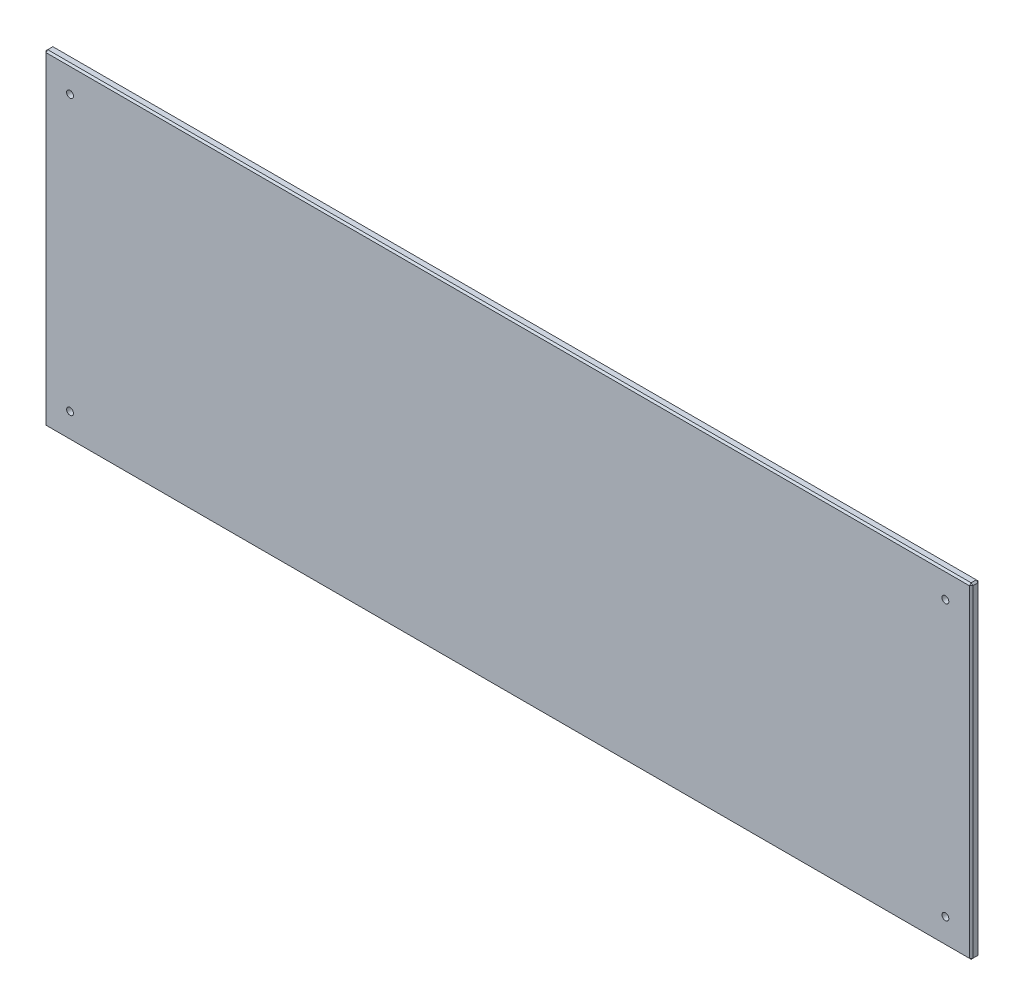
ISO-10303-21;
HEADER;
FILE_DESCRIPTION(('STEP AP214'),'2;1');
FILE_NAME('part.step','',(''),(''),'','','');
FILE_SCHEMA(('AUTOMOTIVE_DESIGN { 1 0 10303 214 1 1 1 1 }'));
ENDSEC;
DATA;
#1=APPLICATION_CONTEXT('core data for automotive mechanical design processes');
#2=APPLICATION_PROTOCOL_DEFINITION('international standard','automotive_design',2000,#1);
#3=PRODUCT_CONTEXT('',#1,'mechanical');
#4=PRODUCT('Part','Part','',(#3));
#5=PRODUCT_RELATED_PRODUCT_CATEGORY('part','',(#4));
#6=PRODUCT_DEFINITION_FORMATION('','',#4);
#7=PRODUCT_DEFINITION_CONTEXT('part definition',#1,'design');
#8=PRODUCT_DEFINITION('design','',#6,#7);
#9=PRODUCT_DEFINITION_SHAPE('','',#8);
#10=(LENGTH_UNIT() NAMED_UNIT(*) SI_UNIT(.MILLI.,.METRE.));
#11=(NAMED_UNIT(*) PLANE_ANGLE_UNIT() SI_UNIT($,.RADIAN.));
#12=(NAMED_UNIT(*) SI_UNIT($,.STERADIAN.) SOLID_ANGLE_UNIT());
#13=UNCERTAINTY_MEASURE_WITH_UNIT(LENGTH_MEASURE(1.E-05),#10,'distance_accuracy_value','');
#14=(GEOMETRIC_REPRESENTATION_CONTEXT(3) GLOBAL_UNCERTAINTY_ASSIGNED_CONTEXT((#13)) GLOBAL_UNIT_ASSIGNED_CONTEXT((#10,
#11,#12)) REPRESENTATION_CONTEXT('',''));
#15=CARTESIAN_POINT('',(0.,0.,0.));
#16=DIRECTION('',(0.,0.,1.));
#17=DIRECTION('',(1.,0.,0.));
#18=AXIS2_PLACEMENT_3D('',#15,#16,#17);
#19=CARTESIAN_POINT('',(0.,0.,5.));
#20=DIRECTION('',(1.,0.,0.));
#21=DIRECTION('',(0.,0.,-1.));
#22=AXIS2_PLACEMENT_3D('',#19,#20,#21);
#23=PLANE('',#22);
#24=DIRECTION('',(0.,0.,-1.));
#25=VECTOR('',#24,1.);
#26=CARTESIAN_POINT('',(0.,189.,5.));
#27=LINE('',#26,#25);
#28=CARTESIAN_POINT('',(0.,189.,4.00000000000011));
#29=VERTEX_POINT('',#28);
#30=CARTESIAN_POINT('',(0.,189.,0.99999999999989));
#31=VERTEX_POINT('',#30);
#32=EDGE_CURVE('E219',#29,#31,#27,.T.);
#33=ORIENTED_EDGE('',*,*,#32,.T.);
#34=DIRECTION('',(0.,-1.,0.));
#35=VECTOR('',#34,1.);
#36=CARTESIAN_POINT('',(0.,0.,0.99999999999989));
#37=LINE('',#36,#35);
#38=CARTESIAN_POINT('',(0.,0.99999999999989,0.99999999999989));
#39=VERTEX_POINT('',#38);
#40=EDGE_CURVE('E222',#31,#39,#37,.T.);
#41=ORIENTED_EDGE('',*,*,#40,.T.);
#42=DIRECTION('',(0.,0.,1.));
#43=VECTOR('',#42,1.);
#44=CARTESIAN_POINT('',(0.,0.99999999999989,5.));
#45=LINE('',#44,#43);
#46=CARTESIAN_POINT('',(0.,0.99999999999989,4.00000000000011));
#47=VERTEX_POINT('',#46);
#48=EDGE_CURVE('E213',#39,#47,#45,.T.);
#49=ORIENTED_EDGE('',*,*,#48,.T.);
#50=DIRECTION('',(0.,1.,0.));
#51=VECTOR('',#50,1.);
#52=CARTESIAN_POINT('',(0.,0.,4.00000000000011));
#53=LINE('',#52,#51);
#54=EDGE_CURVE('E216',#47,#29,#53,.T.);
#55=ORIENTED_EDGE('',*,*,#54,.T.);
#56=EDGE_LOOP('',(#33,#41,#49,#55));
#57=FACE_BOUND('',#56,.T.);
#58=ADVANCED_FACE('F40',(#57),#23,.F.);
#59=CARTESIAN_POINT('',(0.,0.,5.));
#60=DIRECTION('',(0.,1.,0.));
#61=DIRECTION('',(0.,0.,1.));
#62=AXIS2_PLACEMENT_3D('',#59,#60,#61);
#63=PLANE('',#62);
#64=DIRECTION('',(0.,0.,-1.));
#65=VECTOR('',#64,1.);
#66=CARTESIAN_POINT('',(0.99999999999989,0.,5.));
#67=LINE('',#66,#65);
#68=CARTESIAN_POINT('',(0.99999999999989,0.,4.00000000000011));
#69=VERTEX_POINT('',#68);
#70=CARTESIAN_POINT('',(0.99999999999989,0.,0.99999999999989));
#71=VERTEX_POINT('',#70);
#72=EDGE_CURVE('E168',#69,#71,#67,.T.);
#73=ORIENTED_EDGE('',*,*,#72,.T.);
#74=DIRECTION('',(1.,0.,0.));
#75=VECTOR('',#74,1.);
#76=CARTESIAN_POINT('',(540.,0.,0.99999999999989));
#77=LINE('',#76,#75);
#78=CARTESIAN_POINT('',(539.,0.,0.99999999999989));
#79=VERTEX_POINT('',#78);
#80=EDGE_CURVE('E136',#71,#79,#77,.T.);
#81=ORIENTED_EDGE('',*,*,#80,.T.);
#82=DIRECTION('',(0.,0.,1.));
#83=VECTOR('',#82,1.);
#84=CARTESIAN_POINT('',(539.,0.,5.));
#85=LINE('',#84,#83);
#86=CARTESIAN_POINT('',(539.,0.,4.00000000000011));
#87=VERTEX_POINT('',#86);
#88=EDGE_CURVE('E157',#79,#87,#85,.T.);
#89=ORIENTED_EDGE('',*,*,#88,.T.);
#90=DIRECTION('',(-1.,0.,0.));
#91=VECTOR('',#90,1.);
#92=CARTESIAN_POINT('',(0.,0.,4.00000000000011));
#93=LINE('',#92,#91);
#94=EDGE_CURVE('E164',#87,#69,#93,.T.);
#95=ORIENTED_EDGE('',*,*,#94,.T.);
#96=EDGE_LOOP('',(#73,#81,#89,#95));
#97=FACE_BOUND('',#96,.T.);
#98=ADVANCED_FACE('F166',(#97),#63,.F.);
#99=CARTESIAN_POINT('',(540.,0.,5.));
#100=DIRECTION('',(-1.,0.,0.));
#101=DIRECTION('',(0.,0.,1.));
#102=AXIS2_PLACEMENT_3D('',#99,#100,#101);
#103=PLANE('',#102);
#104=DIRECTION('',(0.,0.,-1.));
#105=VECTOR('',#104,1.);
#106=CARTESIAN_POINT('',(540.,0.99999999999989,5.));
#107=LINE('',#106,#105);
#108=CARTESIAN_POINT('',(540.,0.99999999999989,4.00000000000011));
#109=VERTEX_POINT('',#108);
#110=CARTESIAN_POINT('',(540.,0.99999999999989,0.99999999999989));
#111=VERTEX_POINT('',#110);
#112=EDGE_CURVE('E193',#109,#111,#107,.T.);
#113=ORIENTED_EDGE('',*,*,#112,.T.);
#114=DIRECTION('',(0.,1.,0.));
#115=VECTOR('',#114,1.);
#116=CARTESIAN_POINT('',(540.,190.,0.99999999999989));
#117=LINE('',#116,#115);
#118=CARTESIAN_POINT('',(540.,189.,0.99999999999989));
#119=VERTEX_POINT('',#118);
#120=EDGE_CURVE('E196',#111,#119,#117,.T.);
#121=ORIENTED_EDGE('',*,*,#120,.T.);
#122=DIRECTION('',(0.,0.,1.));
#123=VECTOR('',#122,1.);
#124=CARTESIAN_POINT('',(540.,189.,5.));
#125=LINE('',#124,#123);
#126=CARTESIAN_POINT('',(540.,189.,4.00000000000011));
#127=VERTEX_POINT('',#126);
#128=EDGE_CURVE('E187',#119,#127,#125,.T.);
#129=ORIENTED_EDGE('',*,*,#128,.T.);
#130=DIRECTION('',(0.,-1.,0.));
#131=VECTOR('',#130,1.);
#132=CARTESIAN_POINT('',(540.,0.,4.00000000000011));
#133=LINE('',#132,#131);
#134=EDGE_CURVE('E190',#127,#109,#133,.T.);
#135=ORIENTED_EDGE('',*,*,#134,.T.);
#136=EDGE_LOOP('',(#113,#121,#129,#135));
#137=FACE_BOUND('',#136,.T.);
#138=ADVANCED_FACE('F347',(#137),#103,.F.);
#139=CARTESIAN_POINT('',(0.,190.,5.));
#140=DIRECTION('',(0.,-1.,0.));
#141=DIRECTION('',(0.,0.,-1.));
#142=AXIS2_PLACEMENT_3D('',#139,#140,#141);
#143=PLANE('',#142);
#144=DIRECTION('',(-1.,0.,0.));
#145=VECTOR('',#144,1.);
#146=CARTESIAN_POINT('',(0.,190.,0.99999999999989));
#147=LINE('',#146,#145);
#148=CARTESIAN_POINT('',(539.,190.,0.99999999999989));
#149=VERTEX_POINT('',#148);
#150=CARTESIAN_POINT('',(0.99999999999989,190.,0.99999999999989));
#151=VERTEX_POINT('',#150);
#152=EDGE_CURVE('E206',#149,#151,#147,.T.);
#153=ORIENTED_EDGE('',*,*,#152,.T.);
#154=DIRECTION('',(0.,0.,1.));
#155=VECTOR('',#154,1.);
#156=CARTESIAN_POINT('',(0.99999999999989,190.,5.));
#157=LINE('',#156,#155);
#158=CARTESIAN_POINT('',(0.99999999999989,190.,4.00000000000011));
#159=VERTEX_POINT('',#158);
#160=EDGE_CURVE('E210',#151,#159,#157,.T.);
#161=ORIENTED_EDGE('',*,*,#160,.T.);
#162=DIRECTION('',(1.,0.,0.));
#163=VECTOR('',#162,1.);
#164=CARTESIAN_POINT('',(0.,190.,4.00000000000011));
#165=LINE('',#164,#163);
#166=CARTESIAN_POINT('',(539.,190.,4.00000000000011));
#167=VERTEX_POINT('',#166);
#168=EDGE_CURVE('E203',#159,#167,#165,.T.);
#169=ORIENTED_EDGE('',*,*,#168,.T.);
#170=DIRECTION('',(0.,0.,-1.));
#171=VECTOR('',#170,1.);
#172=CARTESIAN_POINT('',(539.,190.,5.));
#173=LINE('',#172,#171);
#174=EDGE_CURVE('E200',#167,#149,#173,.T.);
#175=ORIENTED_EDGE('',*,*,#174,.T.);
#176=EDGE_LOOP('',(#153,#161,#169,#175));
#177=FACE_BOUND('',#176,.T.);
#178=ADVANCED_FACE('F475',(#177),#143,.F.);
#179=CARTESIAN_POINT('',(0.,0.,5.));
#180=DIRECTION('',(0.,0.,-1.));
#181=DIRECTION('',(-1.,0.,0.));
#182=AXIS2_PLACEMENT_3D('',#179,#180,#181);
#183=PLANE('',#182);
#184=CARTESIAN_POINT('',(525.,15.,5.));
#185=DIRECTION('',(0.,0.,1.));
#186=DIRECTION('',(1.,0.,0.));
#187=AXIS2_PLACEMENT_3D('',#184,#185,#186);
#188=CIRCLE('',#187,2.);
#189=CARTESIAN_POINT('',(527.,15.,5.));
#190=VERTEX_POINT('',#189);
#191=EDGE_CURVE('E520',#190,#190,#188,.T.);
#192=ORIENTED_EDGE('',*,*,#191,.F.);
#193=EDGE_LOOP('',(#192));
#194=FACE_BOUND('',#193,.T.);
#195=CARTESIAN_POINT('',(15.,175.,5.));
#196=DIRECTION('',(0.,0.,1.));
#197=DIRECTION('',(1.,0.,0.));
#198=AXIS2_PLACEMENT_3D('',#195,#196,#197);
#199=CIRCLE('',#198,2.);
#200=CARTESIAN_POINT('',(17.,175.,5.));
#201=VERTEX_POINT('',#200);
#202=EDGE_CURVE('E511',#201,#201,#199,.T.);
#203=ORIENTED_EDGE('',*,*,#202,.F.);
#204=EDGE_LOOP('',(#203));
#205=FACE_BOUND('',#204,.T.);
#206=CARTESIAN_POINT('',(15.,15.,5.));
#207=DIRECTION('',(0.,0.,1.));
#208=DIRECTION('',(1.,0.,0.));
#209=AXIS2_PLACEMENT_3D('',#206,#207,#208);
#210=CIRCLE('',#209,2.00000000000001);
#211=CARTESIAN_POINT('',(17.,15.,5.));
#212=VERTEX_POINT('',#211);
#213=EDGE_CURVE('E526',#212,#212,#210,.T.);
#214=ORIENTED_EDGE('',*,*,#213,.F.);
#215=EDGE_LOOP('',(#214));
#216=FACE_BOUND('',#215,.T.);
#217=CARTESIAN_POINT('',(525.,175.,5.));
#218=DIRECTION('',(0.,0.,1.));
#219=DIRECTION('',(1.,0.,0.));
#220=AXIS2_PLACEMENT_3D('',#217,#218,#219);
#221=CIRCLE('',#220,2.);
#222=CARTESIAN_POINT('',(527.,175.,5.));
#223=VERTEX_POINT('',#222);
#224=EDGE_CURVE('E503',#223,#223,#221,.T.);
#225=ORIENTED_EDGE('',*,*,#224,.F.);
#226=EDGE_LOOP('',(#225));
#227=FACE_BOUND('',#226,.T.);
#228=DIRECTION('',(0.,1.,0.));
#229=VECTOR('',#228,1.);
#230=CARTESIAN_POINT('',(539.,0.,5.));
#231=LINE('',#230,#229);
#232=CARTESIAN_POINT('',(539.,0.99999999999989,5.));
#233=VERTEX_POINT('',#232);
#234=CARTESIAN_POINT('',(539.,189.,5.));
#235=VERTEX_POINT('',#234);
#236=EDGE_CURVE('E226',#233,#235,#231,.T.);
#237=ORIENTED_EDGE('',*,*,#236,.T.);
#238=DIRECTION('',(-1.,0.,0.));
#239=VECTOR('',#238,1.);
#240=CARTESIAN_POINT('',(0.,189.,5.));
#241=LINE('',#240,#239);
#242=CARTESIAN_POINT('',(0.99999999999989,189.,5.));
#243=VERTEX_POINT('',#242);
#244=EDGE_CURVE('E11',#235,#243,#241,.T.);
#245=ORIENTED_EDGE('',*,*,#244,.T.);
#246=DIRECTION('',(0.,-1.,0.));
#247=VECTOR('',#246,1.);
#248=CARTESIAN_POINT('',(0.99999999999989,0.,5.));
#249=LINE('',#248,#247);
#250=CARTESIAN_POINT('',(0.99999999999989,0.99999999999989,5.));
#251=VERTEX_POINT('',#250);
#252=EDGE_CURVE('E51',#243,#251,#249,.T.);
#253=ORIENTED_EDGE('',*,*,#252,.T.);
#254=DIRECTION('',(1.,0.,0.));
#255=VECTOR('',#254,1.);
#256=CARTESIAN_POINT('',(0.,0.99999999999989,5.));
#257=LINE('',#256,#255);
#258=EDGE_CURVE('E229',#251,#233,#257,.T.);
#259=ORIENTED_EDGE('',*,*,#258,.T.);
#260=EDGE_LOOP('',(#237,#245,#253,#259));
#261=FACE_BOUND('',#260,.T.);
#262=ADVANCED_FACE('F469',(#194,#205,#216,#227,#261),#183,.F.);
#263=CARTESIAN_POINT('',(0.,0.,0.));
#264=DIRECTION('',(0.,0.,-1.));
#265=DIRECTION('',(-1.,0.,0.));
#266=AXIS2_PLACEMENT_3D('',#263,#264,#265);
#267=PLANE('',#266);
#268=CARTESIAN_POINT('',(525.,15.,0.));
#269=DIRECTION('',(0.,0.,1.));
#270=DIRECTION('',(1.,0.,0.));
#271=AXIS2_PLACEMENT_3D('',#268,#269,#270);
#272=CIRCLE('',#271,2.);
#273=CARTESIAN_POINT('',(527.,15.,0.));
#274=VERTEX_POINT('',#273);
#275=EDGE_CURVE('E507',#274,#274,#272,.T.);
#276=ORIENTED_EDGE('',*,*,#275,.T.);
#277=EDGE_LOOP('',(#276));
#278=FACE_BOUND('',#277,.T.);
#279=CARTESIAN_POINT('',(15.,175.,0.));
#280=DIRECTION('',(0.,0.,1.));
#281=DIRECTION('',(1.,0.,0.));
#282=AXIS2_PLACEMENT_3D('',#279,#280,#281);
#283=CIRCLE('',#282,2.);
#284=CARTESIAN_POINT('',(17.,175.,0.));
#285=VERTEX_POINT('',#284);
#286=EDGE_CURVE('E515',#285,#285,#283,.T.);
#287=ORIENTED_EDGE('',*,*,#286,.T.);
#288=EDGE_LOOP('',(#287));
#289=FACE_BOUND('',#288,.T.);
#290=CARTESIAN_POINT('',(15.,15.,0.));
#291=DIRECTION('',(0.,0.,1.));
#292=DIRECTION('',(1.,0.,0.));
#293=AXIS2_PLACEMENT_3D('',#290,#291,#292);
#294=CIRCLE('',#293,2.00000000000001);
#295=CARTESIAN_POINT('',(17.,15.,0.));
#296=VERTEX_POINT('',#295);
#297=EDGE_CURVE('E516',#296,#296,#294,.T.);
#298=ORIENTED_EDGE('',*,*,#297,.T.);
#299=EDGE_LOOP('',(#298));
#300=FACE_BOUND('',#299,.T.);
#301=CARTESIAN_POINT('',(525.,175.,0.));
#302=DIRECTION('',(0.,0.,1.));
#303=DIRECTION('',(1.,0.,0.));
#304=AXIS2_PLACEMENT_3D('',#301,#302,#303);
#305=CIRCLE('',#304,2.);
#306=CARTESIAN_POINT('',(527.,175.,0.));
#307=VERTEX_POINT('',#306);
#308=EDGE_CURVE('E143',#307,#307,#305,.T.);
#309=ORIENTED_EDGE('',*,*,#308,.T.);
#310=EDGE_LOOP('',(#309));
#311=FACE_BOUND('',#310,.T.);
#312=DIRECTION('',(0.,-1.,0.));
#313=VECTOR('',#312,1.);
#314=CARTESIAN_POINT('',(539.,0.,0.));
#315=LINE('',#314,#313);
#316=CARTESIAN_POINT('',(539.,189.,0.));
#317=VERTEX_POINT('',#316);
#318=CARTESIAN_POINT('',(539.,0.99999999999989,0.));
#319=VERTEX_POINT('',#318);
#320=EDGE_CURVE('E182',#317,#319,#315,.T.);
#321=ORIENTED_EDGE('',*,*,#320,.T.);
#322=DIRECTION('',(-1.,0.,0.));
#323=VECTOR('',#322,1.);
#324=CARTESIAN_POINT('',(0.,0.99999999999989,0.));
#325=LINE('',#324,#323);
#326=CARTESIAN_POINT('',(0.99999999999989,0.99999999999989,0.));
#327=VERTEX_POINT('',#326);
#328=EDGE_CURVE('E138',#319,#327,#325,.T.);
#329=ORIENTED_EDGE('',*,*,#328,.T.);
#330=DIRECTION('',(0.,1.,0.));
#331=VECTOR('',#330,1.);
#332=CARTESIAN_POINT('',(0.99999999999989,190.,0.));
#333=LINE('',#332,#331);
#334=CARTESIAN_POINT('',(0.99999999999989,189.,0.));
#335=VERTEX_POINT('',#334);
#336=EDGE_CURVE('E171',#327,#335,#333,.T.);
#337=ORIENTED_EDGE('',*,*,#336,.T.);
#338=DIRECTION('',(1.,0.,0.));
#339=VECTOR('',#338,1.);
#340=CARTESIAN_POINT('',(540.,189.,0.));
#341=LINE('',#340,#339);
#342=EDGE_CURVE('E175',#335,#317,#341,.T.);
#343=ORIENTED_EDGE('',*,*,#342,.T.);
#344=EDGE_LOOP('',(#321,#329,#337,#343));
#345=FACE_BOUND('',#344,.T.);
#346=ADVANCED_FACE('F464',(#278,#289,#300,#311,#345),#267,.T.);
#347=CARTESIAN_POINT('',(0.,189.,5.));
#348=DIRECTION('',(0.,-0.707106781186548,-0.707106781186548));
#349=DIRECTION('',(-1.,0.,0.));
#350=AXIS2_PLACEMENT_3D('',#347,#348,#349);
#351=PLANE('',#350);
#352=DIRECTION('',(0.,-0.707106781186548,0.707106781186548));
#353=VECTOR('',#352,1.);
#354=CARTESIAN_POINT('',(0.99999999999989,189.,5.));
#355=LINE('',#354,#353);
#356=EDGE_CURVE('E45',#243,#159,#355,.F.);
#357=ORIENTED_EDGE('',*,*,#356,.F.);
#358=ORIENTED_EDGE('',*,*,#244,.F.);
#359=DIRECTION('',(0.,0.707106781186548,-0.707106781186548));
#360=VECTOR('',#359,1.);
#361=CARTESIAN_POINT('',(539.,190.,4.00000000000011));
#362=LINE('',#361,#360);
#363=EDGE_CURVE('E302',#167,#235,#362,.F.);
#364=ORIENTED_EDGE('',*,*,#363,.F.);
#365=ORIENTED_EDGE('',*,*,#168,.F.);
#366=EDGE_LOOP('',(#357,#358,#364,#365));
#367=FACE_BOUND('',#366,.T.);
#368=ADVANCED_FACE('F43',(#367),#351,.F.);
#369=CARTESIAN_POINT('',(0.99999999999989,189.,5.));
#370=DIRECTION('',(-0.577350269189626,0.577350269189626,0.577350269189626));
#371=DIRECTION('',(0.707106781186547,0.,0.707106781186547));
#372=AXIS2_PLACEMENT_3D('',#369,#370,#371);
#373=PLANE('',#372);
#374=DIRECTION('',(-0.707106781186548,0.,-0.707106781186548));
#375=VECTOR('',#374,1.);
#376=CARTESIAN_POINT('',(0.99999999999989,189.,5.));
#377=LINE('',#376,#375);
#378=EDGE_CURVE('E296',#243,#29,#377,.T.);
#379=ORIENTED_EDGE('',*,*,#378,.F.);
#380=ORIENTED_EDGE('',*,*,#356,.T.);
#381=DIRECTION('',(0.707106781186548,0.707106781186548,0.));
#382=VECTOR('',#381,1.);
#383=CARTESIAN_POINT('',(0.499999999999945,189.5,4.00000000000011));
#384=LINE('',#383,#382);
#385=EDGE_CURVE('E299',#29,#159,#384,.T.);
#386=ORIENTED_EDGE('',*,*,#385,.F.);
#387=EDGE_LOOP('',(#379,#380,#386));
#388=FACE_BOUND('',#387,.T.);
#389=ADVANCED_FACE('F314',(#388),#373,.T.);
#390=CARTESIAN_POINT('',(539.,190.,4.00000000000011));
#391=DIRECTION('',(0.577350269189626,0.577350269189626,0.577350269189626));
#392=DIRECTION('',(0.707106781186547,0.,-0.707106781186547));
#393=AXIS2_PLACEMENT_3D('',#390,#391,#392);
#394=PLANE('',#393);
#395=DIRECTION('',(0.707106781186548,-0.707106781186548,0.));
#396=VECTOR('',#395,1.);
#397=CARTESIAN_POINT('',(539.,190.,4.00000000000011));
#398=LINE('',#397,#396);
#399=EDGE_CURVE('E288',#167,#127,#398,.T.);
#400=ORIENTED_EDGE('',*,*,#399,.F.);
#401=ORIENTED_EDGE('',*,*,#363,.T.);
#402=DIRECTION('',(-0.707106781186548,0.,0.707106781186548));
#403=VECTOR('',#402,1.);
#404=CARTESIAN_POINT('',(539.5,189.,4.50000000000006));
#405=LINE('',#404,#403);
#406=EDGE_CURVE('E292',#127,#235,#405,.T.);
#407=ORIENTED_EDGE('',*,*,#406,.F.);
#408=EDGE_LOOP('',(#400,#401,#407));
#409=FACE_BOUND('',#408,.T.);
#410=ADVANCED_FACE('F339',(#409),#394,.T.);
#411=CARTESIAN_POINT('',(0.,189.,5.));
#412=DIRECTION('',(0.707106781186548,-0.707106781186548,0.));
#413=DIRECTION('',(0.,0.,-1.));
#414=AXIS2_PLACEMENT_3D('',#411,#412,#413);
#415=PLANE('',#414);
#416=ORIENTED_EDGE('',*,*,#385,.T.);
#417=ORIENTED_EDGE('',*,*,#160,.F.);
#418=DIRECTION('',(-0.707106781186548,-0.707106781186548,0.));
#419=VECTOR('',#418,1.);
#420=CARTESIAN_POINT('',(0.99999999999989,190.,0.99999999999989));
#421=LINE('',#420,#419);
#422=EDGE_CURVE('E281',#31,#151,#421,.F.);
#423=ORIENTED_EDGE('',*,*,#422,.F.);
#424=ORIENTED_EDGE('',*,*,#32,.F.);
#425=EDGE_LOOP('',(#416,#417,#423,#424));
#426=FACE_BOUND('',#425,.T.);
#427=ADVANCED_FACE('F321',(#426),#415,.F.);
#428=CARTESIAN_POINT('',(0.99999999999989,0.,5.));
#429=DIRECTION('',(0.707106781186548,0.,-0.707106781186548));
#430=DIRECTION('',(0.,-1.,0.));
#431=AXIS2_PLACEMENT_3D('',#428,#429,#430);
#432=PLANE('',#431);
#433=ORIENTED_EDGE('',*,*,#378,.T.);
#434=ORIENTED_EDGE('',*,*,#54,.F.);
#435=DIRECTION('',(0.707106781186548,0.,0.707106781186548));
#436=VECTOR('',#435,1.);
#437=CARTESIAN_POINT('',(0.99999999999989,0.99999999999989,5.));
#438=LINE('',#437,#436);
#439=EDGE_CURVE('E277',#251,#47,#438,.F.);
#440=ORIENTED_EDGE('',*,*,#439,.F.);
#441=ORIENTED_EDGE('',*,*,#252,.F.);
#442=EDGE_LOOP('',(#433,#434,#440,#441));
#443=FACE_BOUND('',#442,.T.);
#444=ADVANCED_FACE('F328',(#443),#432,.F.);
#445=CARTESIAN_POINT('',(0.,0.99999999999989,5.));
#446=DIRECTION('',(0.,0.707106781186548,-0.707106781186548));
#447=DIRECTION('',(1.,0.,0.));
#448=AXIS2_PLACEMENT_3D('',#445,#446,#447);
#449=PLANE('',#448);
#450=DIRECTION('',(0.,0.707106781186548,0.707106781186548));
#451=VECTOR('',#450,1.);
#452=CARTESIAN_POINT('',(539.,0.99999999999989,5.));
#453=LINE('',#452,#451);
#454=EDGE_CURVE('E269',#233,#87,#453,.F.);
#455=ORIENTED_EDGE('',*,*,#454,.F.);
#456=ORIENTED_EDGE('',*,*,#258,.F.);
#457=DIRECTION('',(0.,-0.707106781186548,-0.707106781186548));
#458=VECTOR('',#457,1.);
#459=CARTESIAN_POINT('',(0.99999999999989,0.99999999999989,5.));
#460=LINE('',#459,#458);
#461=EDGE_CURVE('E273',#69,#251,#460,.F.);
#462=ORIENTED_EDGE('',*,*,#461,.F.);
#463=ORIENTED_EDGE('',*,*,#94,.F.);
#464=EDGE_LOOP('',(#455,#456,#462,#463));
#465=FACE_BOUND('',#464,.T.);
#466=ADVANCED_FACE('F330',(#465),#449,.F.);
#467=CARTESIAN_POINT('',(539.,0.,5.));
#468=DIRECTION('',(-0.707106781186548,0.,-0.707106781186548));
#469=DIRECTION('',(0.,1.,0.));
#470=AXIS2_PLACEMENT_3D('',#467,#468,#469);
#471=PLANE('',#470);
#472=ORIENTED_EDGE('',*,*,#406,.T.);
#473=ORIENTED_EDGE('',*,*,#236,.F.);
#474=DIRECTION('',(0.707106781186548,0.,-0.707106781186548));
#475=VECTOR('',#474,1.);
#476=CARTESIAN_POINT('',(539.,0.99999999999989,5.));
#477=LINE('',#476,#475);
#478=EDGE_CURVE('E265',#109,#233,#477,.F.);
#479=ORIENTED_EDGE('',*,*,#478,.F.);
#480=ORIENTED_EDGE('',*,*,#134,.F.);
#481=EDGE_LOOP('',(#472,#473,#479,#480));
#482=FACE_BOUND('',#481,.T.);
#483=ADVANCED_FACE('F336',(#482),#471,.F.);
#484=CARTESIAN_POINT('',(539.,190.,5.));
#485=DIRECTION('',(-0.707106781186548,-0.707106781186548,0.));
#486=DIRECTION('',(0.,0.,-1.));
#487=AXIS2_PLACEMENT_3D('',#484,#485,#486);
#488=PLANE('',#487);
#489=ORIENTED_EDGE('',*,*,#399,.T.);
#490=ORIENTED_EDGE('',*,*,#128,.F.);
#491=DIRECTION('',(-0.707106781186548,0.707106781186548,0.));
#492=VECTOR('',#491,1.);
#493=CARTESIAN_POINT('',(540.,189.,0.99999999999989));
#494=LINE('',#493,#492);
#495=EDGE_CURVE('E261',#149,#119,#494,.F.);
#496=ORIENTED_EDGE('',*,*,#495,.F.);
#497=ORIENTED_EDGE('',*,*,#174,.F.);
#498=EDGE_LOOP('',(#489,#490,#496,#497));
#499=FACE_BOUND('',#498,.T.);
#500=ADVANCED_FACE('F430',(#499),#488,.F.);
#501=CARTESIAN_POINT('',(0.,190.,0.99999999999989));
#502=DIRECTION('',(0.,0.707106781186548,-0.707106781186548));
#503=DIRECTION('',(1.,0.,0.));
#504=AXIS2_PLACEMENT_3D('',#501,#502,#503);
#505=PLANE('',#504);
#506=DIRECTION('',(0.,-0.707106781186548,-0.707106781186548));
#507=VECTOR('',#506,1.);
#508=CARTESIAN_POINT('',(0.99999999999989,190.,0.99999999999989));
#509=LINE('',#508,#507);
#510=EDGE_CURVE('E284',#151,#335,#509,.T.);
#511=ORIENTED_EDGE('',*,*,#510,.F.);
#512=ORIENTED_EDGE('',*,*,#152,.F.);
#513=DIRECTION('',(0.,0.707106781186548,0.707106781186548));
#514=VECTOR('',#513,1.);
#515=CARTESIAN_POINT('',(539.,189.5,0.499999999999945));
#516=LINE('',#515,#514);
#517=EDGE_CURVE('E257',#317,#149,#516,.T.);
#518=ORIENTED_EDGE('',*,*,#517,.F.);
#519=ORIENTED_EDGE('',*,*,#342,.F.);
#520=EDGE_LOOP('',(#511,#512,#518,#519));
#521=FACE_BOUND('',#520,.T.);
#522=ADVANCED_FACE('F423',(#521),#505,.T.);
#523=CARTESIAN_POINT('',(0.99999999999989,190.,0.99999999999989));
#524=DIRECTION('',(-0.577350269189626,0.577350269189626,-0.577350269189626));
#525=DIRECTION('',(-0.707106781186547,0.,0.707106781186547));
#526=AXIS2_PLACEMENT_3D('',#523,#524,#525);
#527=PLANE('',#526);
#528=ORIENTED_EDGE('',*,*,#422,.T.);
#529=ORIENTED_EDGE('',*,*,#510,.T.);
#530=DIRECTION('',(-0.707106781186548,0.,0.707106781186548));
#531=VECTOR('',#530,1.);
#532=CARTESIAN_POINT('',(0.499999999999945,189.,0.499999999999945));
#533=LINE('',#532,#531);
#534=EDGE_CURVE('E253',#31,#335,#533,.F.);
#535=ORIENTED_EDGE('',*,*,#534,.F.);
#536=EDGE_LOOP('',(#528,#529,#535));
#537=FACE_BOUND('',#536,.T.);
#538=ADVANCED_FACE('F416',(#537),#527,.T.);
#539=CARTESIAN_POINT('',(0.99999999999989,0.99999999999989,5.));
#540=DIRECTION('',(-0.577350269189626,-0.577350269189626,0.577350269189626));
#541=DIRECTION('',(0.707106781186547,0.,0.707106781186547));
#542=AXIS2_PLACEMENT_3D('',#539,#540,#541);
#543=PLANE('',#542);
#544=ORIENTED_EDGE('',*,*,#461,.T.);
#545=ORIENTED_EDGE('',*,*,#439,.T.);
#546=DIRECTION('',(-0.707106781186548,0.707106781186548,0.));
#547=VECTOR('',#546,1.);
#548=CARTESIAN_POINT('',(0.499999999999945,0.499999999999945,4.00000000000011));
#549=LINE('',#548,#547);
#550=EDGE_CURVE('E249',#69,#47,#549,.T.);
#551=ORIENTED_EDGE('',*,*,#550,.F.);
#552=EDGE_LOOP('',(#544,#545,#551));
#553=FACE_BOUND('',#552,.T.);
#554=ADVANCED_FACE('F409',(#553),#543,.T.);
#555=CARTESIAN_POINT('',(539.,0.99999999999989,5.));
#556=DIRECTION('',(0.577350269189626,-0.577350269189626,0.577350269189626));
#557=DIRECTION('',(0.707106781186547,0.,-0.707106781186547));
#558=AXIS2_PLACEMENT_3D('',#555,#556,#557);
#559=PLANE('',#558);
#560=ORIENTED_EDGE('',*,*,#478,.T.);
#561=ORIENTED_EDGE('',*,*,#454,.T.);
#562=DIRECTION('',(-0.707106781186548,-0.707106781186548,0.));
#563=VECTOR('',#562,1.);
#564=CARTESIAN_POINT('',(539.5,0.499999999999945,4.00000000000011));
#565=LINE('',#564,#563);
#566=EDGE_CURVE('E160',#109,#87,#565,.T.);
#567=ORIENTED_EDGE('',*,*,#566,.F.);
#568=EDGE_LOOP('',(#560,#561,#567));
#569=FACE_BOUND('',#568,.T.);
#570=ADVANCED_FACE('F402',(#569),#559,.T.);
#571=CARTESIAN_POINT('',(540.,189.,0.99999999999989));
#572=DIRECTION('',(0.577350269189626,0.577350269189626,-0.577350269189626));
#573=DIRECTION('',(-0.707106781186547,0.,-0.707106781186547));
#574=AXIS2_PLACEMENT_3D('',#571,#572,#573);
#575=PLANE('',#574);
#576=ORIENTED_EDGE('',*,*,#517,.T.);
#577=ORIENTED_EDGE('',*,*,#495,.T.);
#578=DIRECTION('',(-0.707106781186548,0.,-0.707106781186548));
#579=VECTOR('',#578,1.);
#580=CARTESIAN_POINT('',(540.,189.,0.99999999999989));
#581=LINE('',#580,#579);
#582=EDGE_CURVE('E244',#317,#119,#581,.F.);
#583=ORIENTED_EDGE('',*,*,#582,.F.);
#584=EDGE_LOOP('',(#576,#577,#583));
#585=FACE_BOUND('',#584,.T.);
#586=ADVANCED_FACE('F395',(#585),#575,.T.);
#587=CARTESIAN_POINT('',(0.,0.,0.99999999999989));
#588=DIRECTION('',(-0.707106781186548,0.,-0.707106781186548));
#589=DIRECTION('',(0.,1.,0.));
#590=AXIS2_PLACEMENT_3D('',#587,#588,#589);
#591=PLANE('',#590);
#592=ORIENTED_EDGE('',*,*,#534,.T.);
#593=ORIENTED_EDGE('',*,*,#336,.F.);
#594=DIRECTION('',(0.707106781186548,0.,-0.707106781186548));
#595=VECTOR('',#594,1.);
#596=CARTESIAN_POINT('',(0.99999999999989,0.99999999999989,0.));
#597=LINE('',#596,#595);
#598=EDGE_CURVE('E240',#39,#327,#597,.T.);
#599=ORIENTED_EDGE('',*,*,#598,.F.);
#600=ORIENTED_EDGE('',*,*,#40,.F.);
#601=EDGE_LOOP('',(#592,#593,#599,#600));
#602=FACE_BOUND('',#601,.T.);
#603=ADVANCED_FACE('F388',(#602),#591,.T.);
#604=CARTESIAN_POINT('',(0.99999999999989,0.,5.));
#605=DIRECTION('',(0.707106781186548,0.707106781186548,0.));
#606=DIRECTION('',(0.,0.,-1.));
#607=AXIS2_PLACEMENT_3D('',#604,#605,#606);
#608=PLANE('',#607);
#609=ORIENTED_EDGE('',*,*,#550,.T.);
#610=ORIENTED_EDGE('',*,*,#48,.F.);
#611=DIRECTION('',(0.707106781186548,-0.707106781186548,0.));
#612=VECTOR('',#611,1.);
#613=CARTESIAN_POINT('',(0.499999999999945,0.499999999999945,0.99999999999989));
#614=LINE('',#613,#612);
#615=EDGE_CURVE('E154',#71,#39,#614,.F.);
#616=ORIENTED_EDGE('',*,*,#615,.F.);
#617=ORIENTED_EDGE('',*,*,#72,.F.);
#618=EDGE_LOOP('',(#609,#610,#616,#617));
#619=FACE_BOUND('',#618,.T.);
#620=ADVANCED_FACE('F382',(#619),#608,.F.);
#621=CARTESIAN_POINT('',(540.,0.99999999999989,5.));
#622=DIRECTION('',(-0.707106781186548,0.707106781186548,0.));
#623=DIRECTION('',(0.,0.,-1.));
#624=AXIS2_PLACEMENT_3D('',#621,#622,#623);
#625=PLANE('',#624);
#626=ORIENTED_EDGE('',*,*,#566,.T.);
#627=ORIENTED_EDGE('',*,*,#88,.F.);
#628=DIRECTION('',(0.707106781186548,0.707106781186548,0.));
#629=VECTOR('',#628,1.);
#630=CARTESIAN_POINT('',(539.,0.,0.99999999999989));
#631=LINE('',#630,#629);
#632=EDGE_CURVE('E146',#111,#79,#631,.F.);
#633=ORIENTED_EDGE('',*,*,#632,.F.);
#634=ORIENTED_EDGE('',*,*,#112,.F.);
#635=EDGE_LOOP('',(#626,#627,#633,#634));
#636=FACE_BOUND('',#635,.T.);
#637=ADVANCED_FACE('F158',(#636),#625,.F.);
#638=CARTESIAN_POINT('',(540.,0.,0.99999999999989));
#639=DIRECTION('',(0.707106781186548,0.,-0.707106781186548));
#640=DIRECTION('',(0.,-1.,0.));
#641=AXIS2_PLACEMENT_3D('',#638,#639,#640);
#642=PLANE('',#641);
#643=ORIENTED_EDGE('',*,*,#582,.T.);
#644=ORIENTED_EDGE('',*,*,#120,.F.);
#645=DIRECTION('',(0.707106781186548,0.,0.707106781186548));
#646=VECTOR('',#645,1.);
#647=CARTESIAN_POINT('',(539.5,0.99999999999989,0.499999999999945));
#648=LINE('',#647,#646);
#649=EDGE_CURVE('E150',#319,#111,#648,.T.);
#650=ORIENTED_EDGE('',*,*,#649,.F.);
#651=ORIENTED_EDGE('',*,*,#320,.F.);
#652=EDGE_LOOP('',(#643,#644,#650,#651));
#653=FACE_BOUND('',#652,.T.);
#654=ADVANCED_FACE('F369',(#653),#642,.T.);
#655=CARTESIAN_POINT('',(0.99999999999989,0.99999999999989,0.));
#656=DIRECTION('',(-0.577350269189626,-0.577350269189626,-0.577350269189626));
#657=DIRECTION('',(-0.707106781186547,0.,0.707106781186547));
#658=AXIS2_PLACEMENT_3D('',#655,#656,#657);
#659=PLANE('',#658);
#660=ORIENTED_EDGE('',*,*,#615,.T.);
#661=ORIENTED_EDGE('',*,*,#598,.T.);
#662=DIRECTION('',(0.,-0.707106781186548,0.707106781186548));
#663=VECTOR('',#662,1.);
#664=CARTESIAN_POINT('',(0.99999999999989,0.99999999999989,0.));
#665=LINE('',#664,#663);
#666=EDGE_CURVE('E142',#71,#327,#665,.F.);
#667=ORIENTED_EDGE('',*,*,#666,.F.);
#668=EDGE_LOOP('',(#660,#661,#667));
#669=FACE_BOUND('',#668,.T.);
#670=ADVANCED_FACE('F363',(#669),#659,.T.);
#671=CARTESIAN_POINT('',(539.,0.,0.99999999999989));
#672=DIRECTION('',(0.577350269189626,-0.577350269189626,-0.577350269189626));
#673=DIRECTION('',(-0.707106781186547,0.,-0.707106781186547));
#674=AXIS2_PLACEMENT_3D('',#671,#672,#673);
#675=PLANE('',#674);
#676=ORIENTED_EDGE('',*,*,#649,.T.);
#677=ORIENTED_EDGE('',*,*,#632,.T.);
#678=DIRECTION('',(0.,0.707106781186548,-0.707106781186548));
#679=VECTOR('',#678,1.);
#680=CARTESIAN_POINT('',(539.,0.,0.99999999999989));
#681=LINE('',#680,#679);
#682=EDGE_CURVE('E132',#319,#79,#681,.F.);
#683=ORIENTED_EDGE('',*,*,#682,.F.);
#684=EDGE_LOOP('',(#676,#677,#683));
#685=FACE_BOUND('',#684,.T.);
#686=ADVANCED_FACE('F148',(#685),#675,.T.);
#687=CARTESIAN_POINT('',(0.,0.,0.99999999999989));
#688=DIRECTION('',(0.,-0.707106781186548,-0.707106781186548));
#689=DIRECTION('',(-1.,0.,0.));
#690=AXIS2_PLACEMENT_3D('',#687,#688,#689);
#691=PLANE('',#690);
#692=ORIENTED_EDGE('',*,*,#666,.T.);
#693=ORIENTED_EDGE('',*,*,#328,.F.);
#694=ORIENTED_EDGE('',*,*,#682,.T.);
#695=ORIENTED_EDGE('',*,*,#80,.F.);
#696=EDGE_LOOP('',(#692,#693,#694,#695));
#697=FACE_BOUND('',#696,.T.);
#698=ADVANCED_FACE('F134',(#697),#691,.T.);
#699=CARTESIAN_POINT('',(525.,175.,0.));
#700=DIRECTION('',(0.,0.,1.));
#701=DIRECTION('',(1.,0.,0.));
#702=AXIS2_PLACEMENT_3D('',#699,#700,#701);
#703=CYLINDRICAL_SURFACE('',#702,2.);
#704=ORIENTED_EDGE('',*,*,#308,.F.);
#705=EDGE_LOOP('',(#704));
#706=FACE_BOUND('',#705,.T.);
#707=ORIENTED_EDGE('',*,*,#224,.T.);
#708=EDGE_LOOP('',(#707));
#709=FACE_BOUND('',#708,.T.);
#710=ADVANCED_FACE('F357',(#706,#709),#703,.F.);
#711=CARTESIAN_POINT('',(15.,15.,0.));
#712=DIRECTION('',(0.,0.,1.));
#713=DIRECTION('',(1.,0.,0.));
#714=AXIS2_PLACEMENT_3D('',#711,#712,#713);
#715=CYLINDRICAL_SURFACE('',#714,2.00000000000001);
#716=ORIENTED_EDGE('',*,*,#297,.F.);
#717=EDGE_LOOP('',(#716));
#718=FACE_BOUND('',#717,.T.);
#719=ORIENTED_EDGE('',*,*,#213,.T.);
#720=EDGE_LOOP('',(#719));
#721=FACE_BOUND('',#720,.T.);
#722=ADVANCED_FACE('F536',(#718,#721),#715,.F.);
#723=CARTESIAN_POINT('',(15.,175.,0.));
#724=DIRECTION('',(0.,0.,1.));
#725=DIRECTION('',(1.,0.,0.));
#726=AXIS2_PLACEMENT_3D('',#723,#724,#725);
#727=CYLINDRICAL_SURFACE('',#726,2.);
#728=ORIENTED_EDGE('',*,*,#286,.F.);
#729=EDGE_LOOP('',(#728));
#730=FACE_BOUND('',#729,.T.);
#731=ORIENTED_EDGE('',*,*,#202,.T.);
#732=EDGE_LOOP('',(#731));
#733=FACE_BOUND('',#732,.T.);
#734=ADVANCED_FACE('F539',(#730,#733),#727,.F.);
#735=CARTESIAN_POINT('',(525.,15.,0.));
#736=DIRECTION('',(0.,0.,1.));
#737=DIRECTION('',(1.,0.,0.));
#738=AXIS2_PLACEMENT_3D('',#735,#736,#737);
#739=CYLINDRICAL_SURFACE('',#738,2.);
#740=ORIENTED_EDGE('',*,*,#275,.F.);
#741=EDGE_LOOP('',(#740));
#742=FACE_BOUND('',#741,.T.);
#743=ORIENTED_EDGE('',*,*,#191,.T.);
#744=EDGE_LOOP('',(#743));
#745=FACE_BOUND('',#744,.T.);
#746=ADVANCED_FACE('F560',(#742,#745),#739,.F.);
#747=CLOSED_SHELL('',(#58,#98,#138,#178,#262,#346,#368,#389,#410,#427,#444,#466,#483,#500,#522,
#538,#554,#570,#586,#603,#620,#637,#654,#670,#686,#698,#710,#722,#734,#746));
#748=MANIFOLD_SOLID_BREP('B2',#747);
#749=ADVANCED_BREP_SHAPE_REPRESENTATION('',(#18,#748),#14);
#750=SHAPE_DEFINITION_REPRESENTATION(#9,#749);
ENDSEC;
END-ISO-10303-21;
